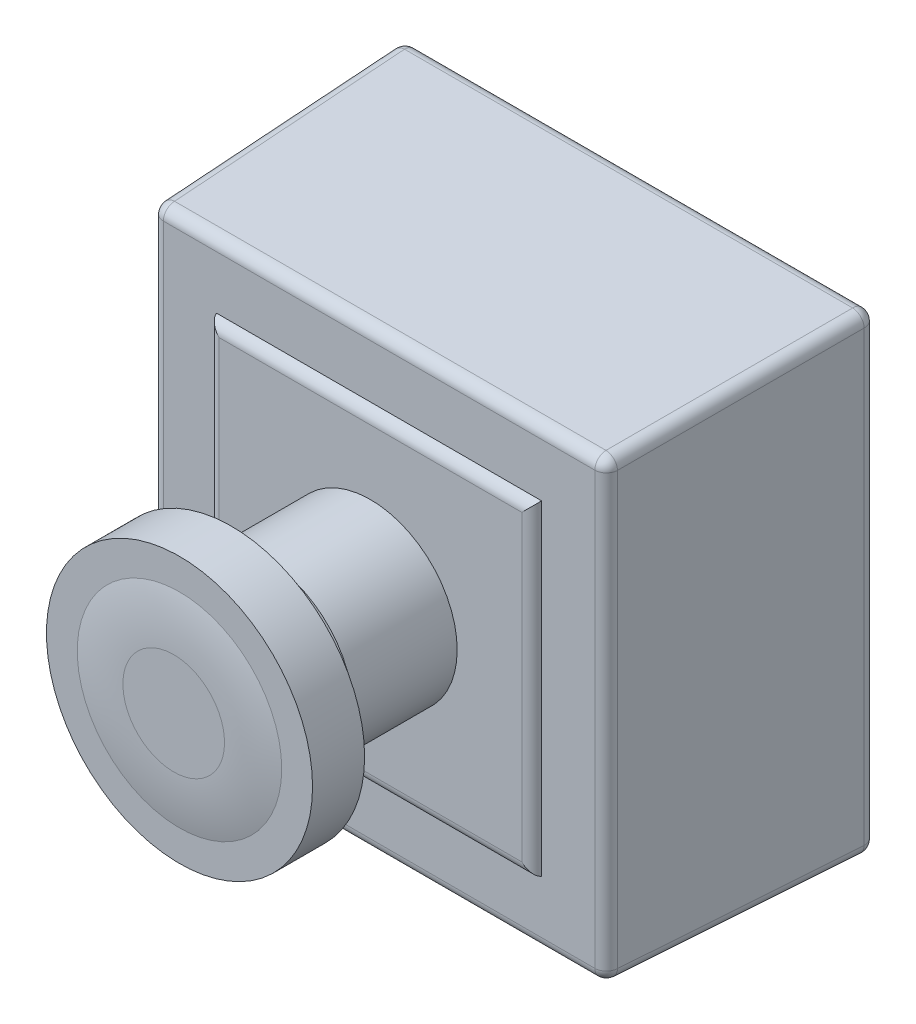
ISO-10303-21;
HEADER;
FILE_DESCRIPTION(('STEP AP214'),'2;1');
FILE_NAME('part.step','',(''),(''),'','','');
FILE_SCHEMA(('AUTOMOTIVE_DESIGN { 1 0 10303 214 1 1 1 1 }'));
ENDSEC;
DATA;
#1=APPLICATION_CONTEXT('core data for automotive mechanical design processes');
#2=APPLICATION_PROTOCOL_DEFINITION('international standard','automotive_design',2000,#1);
#3=PRODUCT_CONTEXT('',#1,'mechanical');
#4=PRODUCT('Part','Part','',(#3));
#5=PRODUCT_RELATED_PRODUCT_CATEGORY('part','',(#4));
#6=PRODUCT_DEFINITION_FORMATION('','',#4);
#7=PRODUCT_DEFINITION_CONTEXT('part definition',#1,'design');
#8=PRODUCT_DEFINITION('design','',#6,#7);
#9=PRODUCT_DEFINITION_SHAPE('','',#8);
#10=(LENGTH_UNIT() NAMED_UNIT(*) SI_UNIT(.MILLI.,.METRE.));
#11=(NAMED_UNIT(*) PLANE_ANGLE_UNIT() SI_UNIT($,.RADIAN.));
#12=(NAMED_UNIT(*) SI_UNIT($,.STERADIAN.) SOLID_ANGLE_UNIT());
#13=UNCERTAINTY_MEASURE_WITH_UNIT(LENGTH_MEASURE(1.E-05),#10,'distance_accuracy_value','');
#14=(GEOMETRIC_REPRESENTATION_CONTEXT(3) GLOBAL_UNCERTAINTY_ASSIGNED_CONTEXT((#13)) GLOBAL_UNIT_ASSIGNED_CONTEXT((#10,
#11,#12)) REPRESENTATION_CONTEXT('',''));
#15=CARTESIAN_POINT('',(0.,0.,0.));
#16=DIRECTION('',(0.,0.,1.));
#17=DIRECTION('',(1.,0.,0.));
#18=AXIS2_PLACEMENT_3D('',#15,#16,#17);
#19=CARTESIAN_POINT('',(0.,0.,22.6));
#20=DIRECTION('',(0.,0.,1.));
#21=DIRECTION('',(1.,0.,0.));
#22=AXIS2_PLACEMENT_3D('',#19,#20,#21);
#23=PLANE('',#22);
#24=DIRECTION('',(0.,1.,0.));
#25=VECTOR('',#24,1.);
#26=CARTESIAN_POINT('',(-18.6451018346794,-19.6107906094865,22.6));
#27=LINE('',#26,#25);
#28=CARTESIAN_POINT('',(-18.6451018346794,18.6451018346794,22.6));
#29=VERTEX_POINT('',#28);
#30=CARTESIAN_POINT('',(-18.6451018346794,-18.6451018346794,22.6));
#31=VERTEX_POINT('',#30);
#32=EDGE_CURVE('E211',#29,#31,#27,.F.);
#33=ORIENTED_EDGE('',*,*,#32,.T.);
#34=DIRECTION('',(-1.,0.,0.));
#35=VECTOR('',#34,1.);
#36=CARTESIAN_POINT('',(19.6107906094865,-18.6451018346794,22.6));
#37=LINE('',#36,#35);
#38=CARTESIAN_POINT('',(18.6451018346794,-18.6451018346794,22.6));
#39=VERTEX_POINT('',#38);
#40=EDGE_CURVE('E213',#31,#39,#37,.F.);
#41=ORIENTED_EDGE('',*,*,#40,.T.);
#42=DIRECTION('',(0.,-1.,0.));
#43=VECTOR('',#42,1.);
#44=CARTESIAN_POINT('',(18.6451018346794,19.6107906094865,22.6));
#45=LINE('',#44,#43);
#46=CARTESIAN_POINT('',(18.6451018346794,18.6451018346794,22.6));
#47=VERTEX_POINT('',#46);
#48=EDGE_CURVE('E207',#39,#47,#45,.F.);
#49=ORIENTED_EDGE('',*,*,#48,.T.);
#50=DIRECTION('',(1.,0.,0.));
#51=VECTOR('',#50,1.);
#52=CARTESIAN_POINT('',(-19.6107906094865,18.6451018346794,22.6));
#53=LINE('',#52,#51);
#54=EDGE_CURVE('E209',#47,#29,#53,.F.);
#55=ORIENTED_EDGE('',*,*,#54,.T.);
#56=EDGE_LOOP('',(#33,#41,#49,#55));
#57=FACE_BOUND('',#56,.T.);
#58=DIRECTION('',(1.,0.,0.));
#59=VECTOR('',#58,1.);
#60=CARTESIAN_POINT('',(0.,14.05,22.6));
#61=LINE('',#60,#59);
#62=CARTESIAN_POINT('',(-14.05,14.05,22.6));
#63=VERTEX_POINT('',#62);
#64=CARTESIAN_POINT('',(14.05,14.05,22.6));
#65=VERTEX_POINT('',#64);
#66=EDGE_CURVE('E186',#63,#65,#61,.T.);
#67=ORIENTED_EDGE('',*,*,#66,.T.);
#68=DIRECTION('',(0.,-1.,0.));
#69=VECTOR('',#68,1.);
#70=CARTESIAN_POINT('',(14.05,0.,22.6));
#71=LINE('',#70,#69);
#72=CARTESIAN_POINT('',(14.05,-14.05,22.6));
#73=VERTEX_POINT('',#72);
#74=EDGE_CURVE('E167',#65,#73,#71,.T.);
#75=ORIENTED_EDGE('',*,*,#74,.T.);
#76=DIRECTION('',(-1.,0.,0.));
#77=VECTOR('',#76,1.);
#78=CARTESIAN_POINT('',(0.,-14.05,22.6));
#79=LINE('',#78,#77);
#80=CARTESIAN_POINT('',(-14.05,-14.05,22.6));
#81=VERTEX_POINT('',#80);
#82=EDGE_CURVE('E177',#73,#81,#79,.T.);
#83=ORIENTED_EDGE('',*,*,#82,.T.);
#84=DIRECTION('',(0.,1.,0.));
#85=VECTOR('',#84,1.);
#86=CARTESIAN_POINT('',(-14.05,0.,22.6));
#87=LINE('',#86,#85);
#88=EDGE_CURVE('E183',#81,#63,#87,.T.);
#89=ORIENTED_EDGE('',*,*,#88,.T.);
#90=EDGE_LOOP('',(#67,#75,#83,#89));
#91=FACE_BOUND('',#90,.T.);
#92=ADVANCED_FACE('F46',(#57,#91),#23,.T.);
#93=CARTESIAN_POINT('',(20.4,20.4,0.));
#94=DIRECTION('',(0.999390827019096,0.,0.034899496702501));
#95=DIRECTION('',(0.034899496702501,0.,-0.999390827019096));
#96=AXIS2_PLACEMENT_3D('',#93,#94,#95);
#97=PLANE('',#96);
#98=DIRECTION('',(0.,1.,0.));
#99=VECTOR('',#98,1.);
#100=CARTESIAN_POINT('',(19.6444926616985,-19.6107906094865,21.6348994967025));
#101=LINE('',#100,#99);
#102=CARTESIAN_POINT('',(19.6444926616985,18.6451018346794,21.6348994967025));
#103=VERTEX_POINT('',#102);
#104=CARTESIAN_POINT('',(19.6444926616985,-18.6451018346794,21.6348994967025));
#105=VERTEX_POINT('',#104);
#106=EDGE_CURVE('E247',#103,#105,#101,.F.);
#107=ORIENTED_EDGE('',*,*,#106,.T.);
#108=DIRECTION('',(-0.0348782627423747,0.0348782627423747,0.998782765958718));
#109=VECTOR('',#108,1.);
#110=CARTESIAN_POINT('',(20.3515828291105,-19.3521920020914,1.38648636883266));
#111=LINE('',#110,#109);
#112=CARTESIAN_POINT('',(20.3638605132285,-19.3644696862094,1.0348994967025));
#113=VERTEX_POINT('',#112);
#114=EDGE_CURVE('E250',#105,#113,#111,.F.);
#115=ORIENTED_EDGE('',*,*,#114,.T.);
#116=DIRECTION('',(0.,1.,0.));
#117=VECTOR('',#116,1.);
#118=CARTESIAN_POINT('',(20.3638605132285,20.4,1.0348994967025));
#119=LINE('',#118,#117);
#120=CARTESIAN_POINT('',(20.3638605132285,19.3644696862094,1.0348994967025));
#121=VERTEX_POINT('',#120);
#122=EDGE_CURVE('E245',#113,#121,#119,.T.);
#123=ORIENTED_EDGE('',*,*,#122,.T.);
#124=DIRECTION('',(-0.0348782627423747,-0.0348782627423747,0.998782765958718));
#125=VECTOR('',#124,1.);
#126=CARTESIAN_POINT('',(20.4012157521571,19.401824925138,-0.0348145867008246));
#127=LINE('',#126,#125);
#128=EDGE_CURVE('E243',#121,#103,#127,.T.);
#129=ORIENTED_EDGE('',*,*,#128,.T.);
#130=EDGE_LOOP('',(#107,#115,#123,#129));
#131=FACE_BOUND('',#130,.T.);
#132=ADVANCED_FACE('F367',(#131),#97,.T.);
#133=CARTESIAN_POINT('',(-20.4,20.4,0.));
#134=DIRECTION('',(0.,0.999390827019096,0.034899496702501));
#135=DIRECTION('',(0.,-0.034899496702501,0.999390827019096));
#136=AXIS2_PLACEMENT_3D('',#133,#134,#135);
#137=PLANE('',#136);
#138=DIRECTION('',(-1.,0.,0.));
#139=VECTOR('',#138,1.);
#140=CARTESIAN_POINT('',(19.6107906094865,19.6444926616985,21.6348994967025));
#141=LINE('',#140,#139);
#142=CARTESIAN_POINT('',(-18.6451018346794,19.6444926616985,21.6348994967025));
#143=VERTEX_POINT('',#142);
#144=CARTESIAN_POINT('',(18.6451018346794,19.6444926616985,21.6348994967025));
#145=VERTEX_POINT('',#144);
#146=EDGE_CURVE('E238',#143,#145,#141,.F.);
#147=ORIENTED_EDGE('',*,*,#146,.T.);
#148=DIRECTION('',(-0.0348782627423747,-0.0348782627423747,0.998782765958718));
#149=VECTOR('',#148,1.);
#150=CARTESIAN_POINT('',(19.3521920020914,20.3515828291105,1.38648636883266));
#151=LINE('',#150,#149);
#152=CARTESIAN_POINT('',(19.3644696862094,20.3638605132285,1.0348994967025));
#153=VERTEX_POINT('',#152);
#154=EDGE_CURVE('E241',#145,#153,#151,.F.);
#155=ORIENTED_EDGE('',*,*,#154,.T.);
#156=DIRECTION('',(-1.,0.,0.));
#157=VECTOR('',#156,1.);
#158=CARTESIAN_POINT('',(-20.4,20.3638605132285,1.0348994967025));
#159=LINE('',#158,#157);
#160=CARTESIAN_POINT('',(-19.3644696862094,20.3638605132285,1.0348994967025));
#161=VERTEX_POINT('',#160);
#162=EDGE_CURVE('E236',#153,#161,#159,.T.);
#163=ORIENTED_EDGE('',*,*,#162,.T.);
#164=DIRECTION('',(0.0348782627423747,-0.0348782627423747,0.998782765958718));
#165=VECTOR('',#164,1.);
#166=CARTESIAN_POINT('',(-19.401824925138,20.4012157521571,-0.0348145867008245));
#167=LINE('',#166,#165);
#168=EDGE_CURVE('E234',#161,#143,#167,.T.);
#169=ORIENTED_EDGE('',*,*,#168,.T.);
#170=EDGE_LOOP('',(#147,#155,#163,#169));
#171=FACE_BOUND('',#170,.T.);
#172=ADVANCED_FACE('F372',(#171),#137,.T.);
#173=CARTESIAN_POINT('',(-20.4,20.4,0.));
#174=DIRECTION('',(-0.999390827019096,0.,0.034899496702501));
#175=DIRECTION('',(0.034899496702501,0.,0.999390827019096));
#176=AXIS2_PLACEMENT_3D('',#173,#174,#175);
#177=PLANE('',#176);
#178=DIRECTION('',(0.,-1.,0.));
#179=VECTOR('',#178,1.);
#180=CARTESIAN_POINT('',(-20.3638605132285,20.4,1.0348994967025));
#181=LINE('',#180,#179);
#182=CARTESIAN_POINT('',(-20.3638605132285,19.3644696862094,1.0348994967025));
#183=VERTEX_POINT('',#182);
#184=CARTESIAN_POINT('',(-20.3638605132285,-19.3644696862094,1.0348994967025));
#185=VERTEX_POINT('',#184);
#186=EDGE_CURVE('E227',#183,#185,#181,.T.);
#187=ORIENTED_EDGE('',*,*,#186,.T.);
#188=DIRECTION('',(0.0348782627423747,0.0348782627423747,0.998782765958718));
#189=VECTOR('',#188,1.);
#190=CARTESIAN_POINT('',(-20.3515828291105,-19.3521920020914,1.38648636883266));
#191=LINE('',#190,#189);
#192=CARTESIAN_POINT('',(-19.6444926616985,-18.6451018346794,21.6348994967025));
#193=VERTEX_POINT('',#192);
#194=EDGE_CURVE('E232',#185,#193,#191,.T.);
#195=ORIENTED_EDGE('',*,*,#194,.T.);
#196=DIRECTION('',(0.,-1.,0.));
#197=VECTOR('',#196,1.);
#198=CARTESIAN_POINT('',(-19.6444926616985,19.6107906094865,21.6348994967025));
#199=LINE('',#198,#197);
#200=CARTESIAN_POINT('',(-19.6444926616985,18.6451018346794,21.6348994967025));
#201=VERTEX_POINT('',#200);
#202=EDGE_CURVE('E229',#193,#201,#199,.F.);
#203=ORIENTED_EDGE('',*,*,#202,.T.);
#204=DIRECTION('',(0.0348782627423747,-0.0348782627423747,0.998782765958718));
#205=VECTOR('',#204,1.);
#206=CARTESIAN_POINT('',(-20.4012157521571,19.401824925138,-0.0348145867008245));
#207=LINE('',#206,#205);
#208=EDGE_CURVE('E225',#201,#183,#207,.F.);
#209=ORIENTED_EDGE('',*,*,#208,.T.);
#210=EDGE_LOOP('',(#187,#195,#203,#209));
#211=FACE_BOUND('',#210,.T.);
#212=ADVANCED_FACE('F378',(#211),#177,.T.);
#213=CARTESIAN_POINT('',(-20.4,-20.4,0.));
#214=DIRECTION('',(0.,-0.999390827019096,0.034899496702501));
#215=DIRECTION('',(0.,-0.034899496702501,-0.999390827019096));
#216=AXIS2_PLACEMENT_3D('',#213,#214,#215);
#217=PLANE('',#216);
#218=DIRECTION('',(1.,0.,0.));
#219=VECTOR('',#218,1.);
#220=CARTESIAN_POINT('',(-19.6107906094865,-19.6444926616985,21.6348994967025));
#221=LINE('',#220,#219);
#222=CARTESIAN_POINT('',(18.6451018346794,-19.6444926616985,21.6348994967025));
#223=VERTEX_POINT('',#222);
#224=CARTESIAN_POINT('',(-18.6451018346794,-19.6444926616985,21.6348994967025));
#225=VERTEX_POINT('',#224);
#226=EDGE_CURVE('E220',#223,#225,#221,.F.);
#227=ORIENTED_EDGE('',*,*,#226,.T.);
#228=DIRECTION('',(0.0348782627423747,0.0348782627423747,0.998782765958718));
#229=VECTOR('',#228,1.);
#230=CARTESIAN_POINT('',(-19.401824925138,-20.4012157521571,-0.0348145867008245));
#231=LINE('',#230,#229);
#232=CARTESIAN_POINT('',(-19.3644696862094,-20.3638605132285,1.0348994967025));
#233=VERTEX_POINT('',#232);
#234=EDGE_CURVE('E223',#225,#233,#231,.F.);
#235=ORIENTED_EDGE('',*,*,#234,.T.);
#236=DIRECTION('',(1.,0.,0.));
#237=VECTOR('',#236,1.);
#238=CARTESIAN_POINT('',(-20.4,-20.3638605132285,1.0348994967025));
#239=LINE('',#238,#237);
#240=CARTESIAN_POINT('',(19.3644696862094,-20.3638605132285,1.0348994967025));
#241=VERTEX_POINT('',#240);
#242=EDGE_CURVE('E218',#233,#241,#239,.T.);
#243=ORIENTED_EDGE('',*,*,#242,.T.);
#244=DIRECTION('',(-0.0348782627423747,0.0348782627423747,0.998782765958718));
#245=VECTOR('',#244,1.);
#246=CARTESIAN_POINT('',(19.3521920020914,-20.3515828291105,1.38648636883266));
#247=LINE('',#246,#245);
#248=EDGE_CURVE('E216',#241,#223,#247,.T.);
#249=ORIENTED_EDGE('',*,*,#248,.T.);
#250=EDGE_LOOP('',(#227,#235,#243,#249));
#251=FACE_BOUND('',#250,.T.);
#252=ADVANCED_FACE('F361',(#251),#217,.T.);
#253=CARTESIAN_POINT('',(0.,0.,0.));
#254=DIRECTION('',(0.,0.,1.));
#255=DIRECTION('',(1.,0.,0.));
#256=AXIS2_PLACEMENT_3D('',#253,#254,#255);
#257=PLANE('',#256);
#258=DIRECTION('',(-1.,0.,0.));
#259=VECTOR('',#258,1.);
#260=CARTESIAN_POINT('',(0.,-19.3644696862094,0.));
#261=LINE('',#260,#259);
#262=CARTESIAN_POINT('',(19.3644696862094,-19.3644696862094,0.));
#263=VERTEX_POINT('',#262);
#264=CARTESIAN_POINT('',(-19.3644696862094,-19.3644696862094,0.));
#265=VERTEX_POINT('',#264);
#266=EDGE_CURVE('E252',#263,#265,#261,.T.);
#267=ORIENTED_EDGE('',*,*,#266,.T.);
#268=DIRECTION('',(0.,1.,0.));
#269=VECTOR('',#268,1.);
#270=CARTESIAN_POINT('',(-19.3644696862094,0.,0.));
#271=LINE('',#270,#269);
#272=CARTESIAN_POINT('',(-19.3644696862094,19.3644696862094,0.));
#273=VERTEX_POINT('',#272);
#274=EDGE_CURVE('E257',#265,#273,#271,.T.);
#275=ORIENTED_EDGE('',*,*,#274,.T.);
#276=DIRECTION('',(1.,0.,0.));
#277=VECTOR('',#276,1.);
#278=CARTESIAN_POINT('',(0.,19.3644696862094,0.));
#279=LINE('',#278,#277);
#280=CARTESIAN_POINT('',(19.3644696862094,19.3644696862094,0.));
#281=VERTEX_POINT('',#280);
#282=EDGE_CURVE('E69',#273,#281,#279,.T.);
#283=ORIENTED_EDGE('',*,*,#282,.T.);
#284=DIRECTION('',(0.,-1.,0.));
#285=VECTOR('',#284,1.);
#286=CARTESIAN_POINT('',(19.3644696862094,0.,0.));
#287=LINE('',#286,#285);
#288=EDGE_CURVE('E254',#281,#263,#287,.T.);
#289=ORIENTED_EDGE('',*,*,#288,.T.);
#290=EDGE_LOOP('',(#267,#275,#283,#289));
#291=FACE_BOUND('',#290,.T.);
#292=CARTESIAN_POINT('',(9.4,11.9,0.));
#293=DIRECTION('',(0.,0.,1.));
#294=DIRECTION('',(1.,0.,0.));
#295=AXIS2_PLACEMENT_3D('',#292,#293,#294);
#296=CIRCLE('',#295,2.5);
#297=CARTESIAN_POINT('',(11.9,11.9,0.));
#298=VERTEX_POINT('',#297);
#299=EDGE_CURVE('E204',#298,#298,#296,.F.);
#300=ORIENTED_EDGE('',*,*,#299,.F.);
#301=EDGE_LOOP('',(#300));
#302=FACE_BOUND('',#301,.T.);
#303=ADVANCED_FACE('F353',(#291,#302),#257,.F.);
#304=CARTESIAN_POINT('',(0.,0.,23.35));
#305=DIRECTION('',(0.,0.,1.));
#306=DIRECTION('',(1.,0.,0.));
#307=AXIS2_PLACEMENT_3D('',#304,#305,#306);
#308=PLANE('',#307);
#309=CARTESIAN_POINT('',(0.,0.,23.35));
#310=DIRECTION('',(0.,0.,1.));
#311=DIRECTION('',(1.,0.,0.));
#312=AXIS2_PLACEMENT_3D('',#309,#310,#311);
#313=CIRCLE('',#312,7.5);
#314=CARTESIAN_POINT('',(7.5,0.,23.35));
#315=VERTEX_POINT('',#314);
#316=EDGE_CURVE('E332',#315,#315,#313,.T.);
#317=ORIENTED_EDGE('',*,*,#316,.F.);
#318=EDGE_LOOP('',(#317));
#319=FACE_BOUND('',#318,.T.);
#320=DIRECTION('',(-1.,0.,0.));
#321=VECTOR('',#320,1.);
#322=CARTESIAN_POINT('',(14.05,-13.0817541634481,23.35));
#323=LINE('',#322,#321);
#324=CARTESIAN_POINT('',(-13.0817541634481,-13.0817541634481,23.35));
#325=VERTEX_POINT('',#324);
#326=CARTESIAN_POINT('',(13.0817541634481,-13.0817541634481,23.35));
#327=VERTEX_POINT('',#326);
#328=EDGE_CURVE('E189',#325,#327,#323,.F.);
#329=ORIENTED_EDGE('',*,*,#328,.T.);
#330=DIRECTION('',(0.,-1.,0.));
#331=VECTOR('',#330,1.);
#332=CARTESIAN_POINT('',(13.0817541634481,14.05,23.35));
#333=LINE('',#332,#331);
#334=CARTESIAN_POINT('',(13.0817541634481,13.0817541634481,23.35));
#335=VERTEX_POINT('',#334);
#336=EDGE_CURVE('E170',#327,#335,#333,.F.);
#337=ORIENTED_EDGE('',*,*,#336,.T.);
#338=DIRECTION('',(1.,0.,0.));
#339=VECTOR('',#338,1.);
#340=CARTESIAN_POINT('',(-14.05,13.0817541634481,23.35));
#341=LINE('',#340,#339);
#342=CARTESIAN_POINT('',(-13.0817541634481,13.0817541634481,23.35));
#343=VERTEX_POINT('',#342);
#344=EDGE_CURVE('E195',#335,#343,#341,.F.);
#345=ORIENTED_EDGE('',*,*,#344,.T.);
#346=DIRECTION('',(0.,1.,0.));
#347=VECTOR('',#346,1.);
#348=CARTESIAN_POINT('',(-13.0817541634481,-14.05,23.35));
#349=LINE('',#348,#347);
#350=EDGE_CURVE('E187',#343,#325,#349,.F.);
#351=ORIENTED_EDGE('',*,*,#350,.T.);
#352=EDGE_LOOP('',(#329,#337,#345,#351));
#353=FACE_BOUND('',#352,.T.);
#354=ADVANCED_FACE('F351',(#319,#353),#308,.T.);
#355=CARTESIAN_POINT('',(-13.0817541634481,14.05,22.35));
#356=DIRECTION('',(0.,-1.,0.));
#357=DIRECTION('',(1.,0.,0.));
#358=AXIS2_PLACEMENT_3D('',#355,#356,#357);
#359=CYLINDRICAL_SURFACE('',#358,1.);
#360=CARTESIAN_POINT('',(-13.0817541634481,13.0817541634481,22.35));
#361=DIRECTION('',(-0.707106781186547,-0.707106781186548,0.));
#362=DIRECTION('',(0.707106781186548,-0.707106781186547,0.));
#363=AXIS2_PLACEMENT_3D('',#360,#361,#362);
#364=ELLIPSE('',#363,1.4142135623731,1.);
#365=EDGE_CURVE('E173',#63,#343,#364,.F.);
#366=ORIENTED_EDGE('',*,*,#365,.F.);
#367=ORIENTED_EDGE('',*,*,#88,.F.);
#368=CARTESIAN_POINT('',(-13.0817541634481,-13.0817541634481,22.35));
#369=DIRECTION('',(0.707106781186548,-0.707106781186547,0.));
#370=DIRECTION('',(-0.707106781186547,-0.707106781186548,0.));
#371=AXIS2_PLACEMENT_3D('',#368,#369,#370);
#372=ELLIPSE('',#371,1.41421356237309,1.);
#373=EDGE_CURVE('E180',#325,#81,#372,.T.);
#374=ORIENTED_EDGE('',*,*,#373,.F.);
#375=ORIENTED_EDGE('',*,*,#350,.F.);
#376=EDGE_LOOP('',(#366,#367,#374,#375));
#377=FACE_BOUND('',#376,.T.);
#378=ADVANCED_FACE('F346',(#377),#359,.T.);
#379=CARTESIAN_POINT('',(-14.05,-13.0817541634481,22.35));
#380=DIRECTION('',(1.,0.,0.));
#381=DIRECTION('',(0.,0.,-1.));
#382=AXIS2_PLACEMENT_3D('',#379,#380,#381);
#383=CYLINDRICAL_SURFACE('',#382,1.);
#384=ORIENTED_EDGE('',*,*,#373,.T.);
#385=ORIENTED_EDGE('',*,*,#82,.F.);
#386=CARTESIAN_POINT('',(13.0817541634481,-13.0817541634481,22.35));
#387=DIRECTION('',(0.707106781186547,0.707106781186548,0.));
#388=DIRECTION('',(0.707106781186548,-0.707106781186547,0.));
#389=AXIS2_PLACEMENT_3D('',#386,#387,#388);
#390=ELLIPSE('',#389,1.4142135623731,1.);
#391=EDGE_CURVE('E163',#327,#73,#390,.T.);
#392=ORIENTED_EDGE('',*,*,#391,.F.);
#393=ORIENTED_EDGE('',*,*,#328,.F.);
#394=EDGE_LOOP('',(#384,#385,#392,#393));
#395=FACE_BOUND('',#394,.T.);
#396=ADVANCED_FACE('F178',(#395),#383,.T.);
#397=CARTESIAN_POINT('',(-14.05,13.0817541634481,22.35));
#398=DIRECTION('',(-1.,0.,0.));
#399=DIRECTION('',(0.,0.,1.));
#400=AXIS2_PLACEMENT_3D('',#397,#398,#399);
#401=CYLINDRICAL_SURFACE('',#400,1.);
#402=ORIENTED_EDGE('',*,*,#365,.T.);
#403=ORIENTED_EDGE('',*,*,#344,.F.);
#404=CARTESIAN_POINT('',(13.0817541634481,13.0817541634481,22.35));
#405=DIRECTION('',(-0.707106781186548,0.707106781186547,0.));
#406=DIRECTION('',(-0.707106781186547,-0.707106781186548,0.));
#407=AXIS2_PLACEMENT_3D('',#404,#405,#406);
#408=ELLIPSE('',#407,1.41421356237309,1.);
#409=EDGE_CURVE('E174',#65,#335,#408,.F.);
#410=ORIENTED_EDGE('',*,*,#409,.F.);
#411=ORIENTED_EDGE('',*,*,#66,.F.);
#412=EDGE_LOOP('',(#402,#403,#410,#411));
#413=FACE_BOUND('',#412,.T.);
#414=ADVANCED_FACE('F349',(#413),#401,.T.);
#415=CARTESIAN_POINT('',(13.0817541634481,14.05,22.35));
#416=DIRECTION('',(0.,1.,0.));
#417=DIRECTION('',(-1.,0.,0.));
#418=AXIS2_PLACEMENT_3D('',#415,#416,#417);
#419=CYLINDRICAL_SURFACE('',#418,1.);
#420=ORIENTED_EDGE('',*,*,#391,.T.);
#421=ORIENTED_EDGE('',*,*,#74,.F.);
#422=ORIENTED_EDGE('',*,*,#409,.T.);
#423=ORIENTED_EDGE('',*,*,#336,.F.);
#424=EDGE_LOOP('',(#420,#421,#422,#423));
#425=FACE_BOUND('',#424,.T.);
#426=ADVANCED_FACE('F165',(#425),#419,.T.);
#427=CARTESIAN_POINT('',(0.,0.,32.35));
#428=DIRECTION('',(0.,0.,-1.));
#429=DIRECTION('',(-1.,0.,0.));
#430=AXIS2_PLACEMENT_3D('',#427,#428,#429);
#431=CYLINDRICAL_SURFACE('',#430,7.5);
#432=CARTESIAN_POINT('',(0.,0.,32.35));
#433=DIRECTION('',(0.,0.,1.));
#434=DIRECTION('',(1.,0.,0.));
#435=AXIS2_PLACEMENT_3D('',#432,#433,#434);
#436=CIRCLE('',#435,7.5);
#437=CARTESIAN_POINT('',(7.5,0.,32.35));
#438=VERTEX_POINT('',#437);
#439=EDGE_CURVE('E199',#438,#438,#436,.T.);
#440=ORIENTED_EDGE('',*,*,#439,.F.);
#441=EDGE_LOOP('',(#440));
#442=FACE_BOUND('',#441,.T.);
#443=ORIENTED_EDGE('',*,*,#316,.T.);
#444=EDGE_LOOP('',(#443));
#445=FACE_BOUND('',#444,.T.);
#446=ADVANCED_FACE('F388',(#442,#445),#431,.T.);
#447=CARTESIAN_POINT('',(0.,0.,32.35));
#448=DIRECTION('',(0.,0.,1.));
#449=DIRECTION('',(1.,0.,0.));
#450=AXIS2_PLACEMENT_3D('',#447,#448,#449);
#451=PLANE('',#450);
#452=CARTESIAN_POINT('',(0.,0.,32.35));
#453=DIRECTION('',(0.,0.,1.));
#454=DIRECTION('',(1.,0.,0.));
#455=AXIS2_PLACEMENT_3D('',#452,#453,#454);
#456=CIRCLE('',#455,5.8);
#457=CARTESIAN_POINT('',(5.8,0.,32.35));
#458=VERTEX_POINT('',#457);
#459=EDGE_CURVE('E198',#458,#458,#456,.T.);
#460=ORIENTED_EDGE('',*,*,#459,.F.);
#461=EDGE_LOOP('',(#460));
#462=FACE_BOUND('',#461,.T.);
#463=ORIENTED_EDGE('',*,*,#439,.T.);
#464=EDGE_LOOP('',(#463));
#465=FACE_BOUND('',#464,.T.);
#466=ADVANCED_FACE('F527',(#462,#465),#451,.T.);
#467=CARTESIAN_POINT('',(0.,0.,35.35));
#468=DIRECTION('',(0.,0.,-1.));
#469=DIRECTION('',(-1.,0.,0.));
#470=AXIS2_PLACEMENT_3D('',#467,#468,#469);
#471=CYLINDRICAL_SURFACE('',#470,5.8);
#472=CARTESIAN_POINT('',(0.,0.,35.35));
#473=DIRECTION('',(0.,0.,1.));
#474=DIRECTION('',(1.,0.,0.));
#475=AXIS2_PLACEMENT_3D('',#472,#473,#474);
#476=CIRCLE('',#475,5.8);
#477=CARTESIAN_POINT('',(5.8,0.,35.35));
#478=VERTEX_POINT('',#477);
#479=EDGE_CURVE('E327',#478,#478,#476,.T.);
#480=ORIENTED_EDGE('',*,*,#479,.F.);
#481=EDGE_LOOP('',(#480));
#482=FACE_BOUND('',#481,.T.);
#483=ORIENTED_EDGE('',*,*,#459,.T.);
#484=EDGE_LOOP('',(#483));
#485=FACE_BOUND('',#484,.T.);
#486=ADVANCED_FACE('F521',(#482,#485),#471,.T.);
#487=CARTESIAN_POINT('',(9.4,11.9,-5.));
#488=DIRECTION('',(0.,0.,1.));
#489=DIRECTION('',(1.,0.,0.));
#490=AXIS2_PLACEMENT_3D('',#487,#488,#489);
#491=CYLINDRICAL_SURFACE('',#490,2.5);
#492=CARTESIAN_POINT('',(9.4,11.9,-5.));
#493=DIRECTION('',(0.,0.,-1.));
#494=DIRECTION('',(-1.,0.,0.));
#495=AXIS2_PLACEMENT_3D('',#492,#493,#494);
#496=CIRCLE('',#495,2.5);
#497=CARTESIAN_POINT('',(6.9,11.9,-5.));
#498=VERTEX_POINT('',#497);
#499=EDGE_CURVE('E322',#498,#498,#496,.T.);
#500=ORIENTED_EDGE('',*,*,#499,.F.);
#501=EDGE_LOOP('',(#500));
#502=FACE_BOUND('',#501,.T.);
#503=ORIENTED_EDGE('',*,*,#299,.T.);
#504=EDGE_LOOP('',(#503));
#505=FACE_BOUND('',#504,.T.);
#506=ADVANCED_FACE('F474',(#502,#505),#491,.T.);
#507=CARTESIAN_POINT('',(9.4,11.9,-5.));
#508=DIRECTION('',(0.,0.,-1.));
#509=DIRECTION('',(-1.,0.,0.));
#510=AXIS2_PLACEMENT_3D('',#507,#508,#509);
#511=PLANE('',#510);
#512=ORIENTED_EDGE('',*,*,#499,.T.);
#513=EDGE_LOOP('',(#512));
#514=FACE_BOUND('',#513,.T.);
#515=ADVANCED_FACE('F469',(#514),#511,.T.);
#516=CARTESIAN_POINT('',(-20.4,19.3644696862094,1.));
#517=DIRECTION('',(1.,0.,0.));
#518=DIRECTION('',(0.,0.,-1.));
#519=AXIS2_PLACEMENT_3D('',#516,#517,#518);
#520=CYLINDRICAL_SURFACE('',#519,1.);
#521=CARTESIAN_POINT('',(-19.3644696862094,19.3644696862094,1.));
#522=DIRECTION('',(-1.,0.,0.));
#523=DIRECTION('',(0.,0.,1.));
#524=AXIS2_PLACEMENT_3D('',#521,#522,#523);
#525=CIRCLE('',#524,1.);
#526=EDGE_CURVE('E321',#161,#273,#525,.T.);
#527=ORIENTED_EDGE('',*,*,#526,.F.);
#528=ORIENTED_EDGE('',*,*,#162,.F.);
#529=CARTESIAN_POINT('',(19.3644696862094,19.3644696862094,1.));
#530=DIRECTION('',(1.,0.,0.));
#531=DIRECTION('',(0.,1.,0.));
#532=AXIS2_PLACEMENT_3D('',#529,#530,#531);
#533=CIRCLE('',#532,1.);
#534=EDGE_CURVE('E319',#281,#153,#533,.T.);
#535=ORIENTED_EDGE('',*,*,#534,.F.);
#536=ORIENTED_EDGE('',*,*,#282,.F.);
#537=EDGE_LOOP('',(#527,#528,#535,#536));
#538=FACE_BOUND('',#537,.T.);
#539=ADVANCED_FACE('F467',(#538),#520,.T.);
#540=CARTESIAN_POINT('',(-19.3644696862094,19.3644696862094,1.));
#541=DIRECTION('',(0.,0.,-1.));
#542=DIRECTION('',(-1.,0.,0.));
#543=AXIS2_PLACEMENT_3D('',#540,#541,#542);
#544=SPHERICAL_SURFACE('',#543,1.);
#545=CARTESIAN_POINT('',(-19.3644696862094,19.3644696862094,1.));
#546=DIRECTION('',(-0.0348782627423748,0.0348782627423746,-0.998782765958718));
#547=DIRECTION('',(-0.999390827019096,0.,0.0348994967025011));
#548=AXIS2_PLACEMENT_3D('',#545,#546,#547);
#549=CIRCLE('',#548,1.);
#550=EDGE_CURVE('E315',#161,#183,#549,.F.);
#551=ORIENTED_EDGE('',*,*,#550,.F.);
#552=ORIENTED_EDGE('',*,*,#526,.T.);
#553=CARTESIAN_POINT('',(-19.3644696862094,19.3644696862094,1.));
#554=DIRECTION('',(0.,1.,0.));
#555=DIRECTION('',(0.,0.,1.));
#556=AXIS2_PLACEMENT_3D('',#553,#554,#555);
#557=CIRCLE('',#556,1.);
#558=EDGE_CURVE('E61',#183,#273,#557,.F.);
#559=ORIENTED_EDGE('',*,*,#558,.F.);
#560=EDGE_LOOP('',(#551,#552,#559));
#561=FACE_BOUND('',#560,.T.);
#562=ADVANCED_FACE('F464',(#561),#544,.T.);
#563=CARTESIAN_POINT('',(19.3644696862094,19.3644696862094,1.));
#564=DIRECTION('',(0.,0.,-1.));
#565=DIRECTION('',(-1.,0.,0.));
#566=AXIS2_PLACEMENT_3D('',#563,#564,#565);
#567=SPHERICAL_SURFACE('',#566,1.);
#568=CARTESIAN_POINT('',(19.3644696862094,19.3644696862094,1.));
#569=DIRECTION('',(0.,1.,0.));
#570=DIRECTION('',(0.,0.,1.));
#571=AXIS2_PLACEMENT_3D('',#568,#569,#570);
#572=CIRCLE('',#571,1.);
#573=EDGE_CURVE('E309',#281,#121,#572,.F.);
#574=ORIENTED_EDGE('',*,*,#573,.F.);
#575=ORIENTED_EDGE('',*,*,#534,.T.);
#576=CARTESIAN_POINT('',(19.3644696862094,19.3644696862094,1.));
#577=DIRECTION('',(0.0348782627423746,0.0348782627423748,-0.998782765958718));
#578=DIRECTION('',(0.,0.999390827019096,0.0348994967025011));
#579=AXIS2_PLACEMENT_3D('',#576,#577,#578);
#580=CIRCLE('',#579,1.);
#581=EDGE_CURVE('E312',#121,#153,#580,.F.);
#582=ORIENTED_EDGE('',*,*,#581,.F.);
#583=EDGE_LOOP('',(#574,#575,#582));
#584=FACE_BOUND('',#583,.T.);
#585=ADVANCED_FACE('F461',(#584),#567,.T.);
#586=CARTESIAN_POINT('',(-19.3644696862094,20.4,1.));
#587=DIRECTION('',(0.,1.,0.));
#588=DIRECTION('',(-1.,0.,0.));
#589=AXIS2_PLACEMENT_3D('',#586,#587,#588);
#590=CYLINDRICAL_SURFACE('',#589,1.);
#591=ORIENTED_EDGE('',*,*,#558,.T.);
#592=ORIENTED_EDGE('',*,*,#274,.F.);
#593=CARTESIAN_POINT('',(-19.3644696862094,-19.3644696862094,1.));
#594=DIRECTION('',(0.,-1.,0.));
#595=DIRECTION('',(0.,0.,-1.));
#596=AXIS2_PLACEMENT_3D('',#593,#594,#595);
#597=CIRCLE('',#596,1.);
#598=EDGE_CURVE('E303',#185,#265,#597,.T.);
#599=ORIENTED_EDGE('',*,*,#598,.F.);
#600=ORIENTED_EDGE('',*,*,#186,.F.);
#601=EDGE_LOOP('',(#591,#592,#599,#600));
#602=FACE_BOUND('',#601,.T.);
#603=ADVANCED_FACE('F457',(#602),#590,.T.);
#604=CARTESIAN_POINT('',(-19.401824925138,19.401824925138,-0.0697140834033256));
#605=DIRECTION('',(-0.0348782627423747,0.0348782627423747,-0.998782765958718));
#606=DIRECTION('',(-0.999390827019096,0.,0.034899496702501));
#607=AXIS2_PLACEMENT_3D('',#604,#605,#606);
#608=CYLINDRICAL_SURFACE('',#607,1.);
#609=ORIENTED_EDGE('',*,*,#550,.T.);
#610=ORIENTED_EDGE('',*,*,#208,.F.);
#611=CARTESIAN_POINT('',(-18.6451018346794,18.6451018346794,21.6));
#612=DIRECTION('',(0.0348782627423738,-0.0348782627423737,0.998782765958718));
#613=DIRECTION('',(0.999390827019096,0.,-0.0348994967025002));
#614=AXIS2_PLACEMENT_3D('',#611,#612,#613);
#615=CIRCLE('',#614,1.);
#616=EDGE_CURVE('E300',#143,#201,#615,.T.);
#617=ORIENTED_EDGE('',*,*,#616,.F.);
#618=ORIENTED_EDGE('',*,*,#168,.F.);
#619=EDGE_LOOP('',(#609,#610,#617,#618));
#620=FACE_BOUND('',#619,.T.);
#621=ADVANCED_FACE('F453',(#620),#608,.T.);
#622=CARTESIAN_POINT('',(0.,18.6451018346794,21.6));
#623=DIRECTION('',(-1.,0.,0.));
#624=DIRECTION('',(0.,0.,1.));
#625=AXIS2_PLACEMENT_3D('',#622,#623,#624);
#626=CYLINDRICAL_SURFACE('',#625,1.);
#627=CARTESIAN_POINT('',(18.6451018346794,18.6451018346794,21.6));
#628=DIRECTION('',(1.,0.,0.));
#629=DIRECTION('',(0.,0.,-1.));
#630=AXIS2_PLACEMENT_3D('',#627,#628,#629);
#631=CIRCLE('',#630,1.);
#632=EDGE_CURVE('E294',#145,#47,#631,.T.);
#633=ORIENTED_EDGE('',*,*,#632,.F.);
#634=ORIENTED_EDGE('',*,*,#146,.F.);
#635=CARTESIAN_POINT('',(-18.6451018346794,18.6451018346794,21.6));
#636=DIRECTION('',(-1.,0.,0.));
#637=DIRECTION('',(0.,0.,1.));
#638=AXIS2_PLACEMENT_3D('',#635,#636,#637);
#639=CIRCLE('',#638,1.);
#640=EDGE_CURVE('E297',#29,#143,#639,.T.);
#641=ORIENTED_EDGE('',*,*,#640,.F.);
#642=ORIENTED_EDGE('',*,*,#54,.F.);
#643=EDGE_LOOP('',(#633,#634,#641,#642));
#644=FACE_BOUND('',#643,.T.);
#645=ADVANCED_FACE('F449',(#644),#626,.T.);
#646=CARTESIAN_POINT('',(19.3521920020914,19.3521920020914,1.35158687213016));
#647=DIRECTION('',(0.0348782627423747,0.0348782627423747,-0.998782765958718));
#648=DIRECTION('',(-0.999390827019096,0.,-0.034899496702501));
#649=AXIS2_PLACEMENT_3D('',#646,#647,#648);
#650=CYLINDRICAL_SURFACE('',#649,1.);
#651=ORIENTED_EDGE('',*,*,#581,.T.);
#652=ORIENTED_EDGE('',*,*,#154,.F.);
#653=CARTESIAN_POINT('',(18.6451018346794,18.6451018346794,21.6));
#654=DIRECTION('',(-0.0348782627423737,-0.0348782627423738,0.998782765958718));
#655=DIRECTION('',(0.,-0.999390827019096,-0.0348994967025002));
#656=AXIS2_PLACEMENT_3D('',#653,#654,#655);
#657=CIRCLE('',#656,1.);
#658=EDGE_CURVE('E292',#103,#145,#657,.T.);
#659=ORIENTED_EDGE('',*,*,#658,.F.);
#660=ORIENTED_EDGE('',*,*,#128,.F.);
#661=EDGE_LOOP('',(#651,#652,#659,#660));
#662=FACE_BOUND('',#661,.T.);
#663=ADVANCED_FACE('F445',(#662),#650,.T.);
#664=CARTESIAN_POINT('',(19.3644696862094,20.4,1.));
#665=DIRECTION('',(0.,-1.,0.));
#666=DIRECTION('',(1.,0.,0.));
#667=AXIS2_PLACEMENT_3D('',#664,#665,#666);
#668=CYLINDRICAL_SURFACE('',#667,1.);
#669=ORIENTED_EDGE('',*,*,#573,.T.);
#670=ORIENTED_EDGE('',*,*,#122,.F.);
#671=CARTESIAN_POINT('',(19.3644696862094,-19.3644696862094,1.));
#672=DIRECTION('',(0.,-1.,0.));
#673=DIRECTION('',(1.,0.,0.));
#674=AXIS2_PLACEMENT_3D('',#671,#672,#673);
#675=CIRCLE('',#674,1.);
#676=EDGE_CURVE('E289',#263,#113,#675,.T.);
#677=ORIENTED_EDGE('',*,*,#676,.F.);
#678=ORIENTED_EDGE('',*,*,#288,.F.);
#679=EDGE_LOOP('',(#669,#670,#677,#678));
#680=FACE_BOUND('',#679,.T.);
#681=ADVANCED_FACE('F441',(#680),#668,.T.);
#682=CARTESIAN_POINT('',(-20.4,-19.3644696862094,1.));
#683=DIRECTION('',(-1.,0.,0.));
#684=DIRECTION('',(0.,0.,1.));
#685=AXIS2_PLACEMENT_3D('',#682,#683,#684);
#686=CYLINDRICAL_SURFACE('',#685,1.);
#687=CARTESIAN_POINT('',(-19.3644696862094,-19.3644696862094,1.));
#688=DIRECTION('',(-1.,0.,0.));
#689=DIRECTION('',(0.,0.,1.));
#690=AXIS2_PLACEMENT_3D('',#687,#688,#689);
#691=CIRCLE('',#690,1.);
#692=EDGE_CURVE('E306',#265,#233,#691,.T.);
#693=ORIENTED_EDGE('',*,*,#692,.F.);
#694=ORIENTED_EDGE('',*,*,#266,.F.);
#695=CARTESIAN_POINT('',(19.3644696862094,-19.3644696862094,1.));
#696=DIRECTION('',(1.,0.,0.));
#697=DIRECTION('',(0.,0.,-1.));
#698=AXIS2_PLACEMENT_3D('',#695,#696,#697);
#699=CIRCLE('',#698,1.);
#700=EDGE_CURVE('E286',#241,#263,#699,.T.);
#701=ORIENTED_EDGE('',*,*,#700,.F.);
#702=ORIENTED_EDGE('',*,*,#242,.F.);
#703=EDGE_LOOP('',(#693,#694,#701,#702));
#704=FACE_BOUND('',#703,.T.);
#705=ADVANCED_FACE('F437',(#704),#686,.T.);
#706=CARTESIAN_POINT('',(-19.3644696862094,-19.3644696862094,1.));
#707=DIRECTION('',(0.,0.,-1.));
#708=DIRECTION('',(-1.,0.,0.));
#709=AXIS2_PLACEMENT_3D('',#706,#707,#708);
#710=SPHERICAL_SURFACE('',#709,1.);
#711=ORIENTED_EDGE('',*,*,#598,.T.);
#712=ORIENTED_EDGE('',*,*,#692,.T.);
#713=CARTESIAN_POINT('',(-19.3644696862094,-19.3644696862094,1.));
#714=DIRECTION('',(-0.0348782627423746,-0.0348782627423748,-0.998782765958718));
#715=DIRECTION('',(0.,0.999390827019096,-0.0348994967025011));
#716=AXIS2_PLACEMENT_3D('',#713,#714,#715);
#717=CIRCLE('',#716,1.);
#718=EDGE_CURVE('E283',#185,#233,#717,.F.);
#719=ORIENTED_EDGE('',*,*,#718,.F.);
#720=EDGE_LOOP('',(#711,#712,#719));
#721=FACE_BOUND('',#720,.T.);
#722=ADVANCED_FACE('F433',(#721),#710,.T.);
#723=CARTESIAN_POINT('',(-18.6451018346794,18.6451018346794,21.6));
#724=DIRECTION('',(0.,0.,1.));
#725=DIRECTION('',(1.,0.,0.));
#726=AXIS2_PLACEMENT_3D('',#723,#724,#725);
#727=SPHERICAL_SURFACE('',#726,1.);
#728=ORIENTED_EDGE('',*,*,#640,.T.);
#729=ORIENTED_EDGE('',*,*,#616,.T.);
#730=CARTESIAN_POINT('',(-18.6451018346794,18.6451018346794,21.6));
#731=DIRECTION('',(0.,1.,0.));
#732=DIRECTION('',(0.,0.,1.));
#733=AXIS2_PLACEMENT_3D('',#730,#731,#732);
#734=CIRCLE('',#733,1.);
#735=EDGE_CURVE('E281',#29,#201,#734,.F.);
#736=ORIENTED_EDGE('',*,*,#735,.F.);
#737=EDGE_LOOP('',(#728,#729,#736));
#738=FACE_BOUND('',#737,.T.);
#739=ADVANCED_FACE('F429',(#738),#727,.T.);
#740=CARTESIAN_POINT('',(18.6451018346794,18.6451018346794,21.6));
#741=DIRECTION('',(0.,0.,1.));
#742=DIRECTION('',(1.,0.,0.));
#743=AXIS2_PLACEMENT_3D('',#740,#741,#742);
#744=SPHERICAL_SURFACE('',#743,1.);
#745=ORIENTED_EDGE('',*,*,#658,.T.);
#746=ORIENTED_EDGE('',*,*,#632,.T.);
#747=CARTESIAN_POINT('',(18.6451018346794,18.6451018346794,21.6));
#748=DIRECTION('',(0.,1.,0.));
#749=DIRECTION('',(0.,0.,1.));
#750=AXIS2_PLACEMENT_3D('',#747,#748,#749);
#751=CIRCLE('',#750,1.);
#752=EDGE_CURVE('E278',#103,#47,#751,.F.);
#753=ORIENTED_EDGE('',*,*,#752,.F.);
#754=EDGE_LOOP('',(#745,#746,#753));
#755=FACE_BOUND('',#754,.T.);
#756=ADVANCED_FACE('F425',(#755),#744,.T.);
#757=CARTESIAN_POINT('',(19.3644696862094,-19.3644696862094,1.));
#758=DIRECTION('',(0.,0.,-1.));
#759=DIRECTION('',(-1.,0.,0.));
#760=AXIS2_PLACEMENT_3D('',#757,#758,#759);
#761=SPHERICAL_SURFACE('',#760,1.);
#762=ORIENTED_EDGE('',*,*,#700,.T.);
#763=ORIENTED_EDGE('',*,*,#676,.T.);
#764=CARTESIAN_POINT('',(19.3644696862094,-19.3644696862094,1.));
#765=DIRECTION('',(0.0348782627423748,-0.0348782627423746,-0.998782765958718));
#766=DIRECTION('',(-0.999390827019096,0.,-0.0348994967025011));
#767=AXIS2_PLACEMENT_3D('',#764,#765,#766);
#768=CIRCLE('',#767,1.);
#769=EDGE_CURVE('E275',#241,#113,#768,.F.);
#770=ORIENTED_EDGE('',*,*,#769,.F.);
#771=EDGE_LOOP('',(#762,#763,#770));
#772=FACE_BOUND('',#771,.T.);
#773=ADVANCED_FACE('F421',(#772),#761,.T.);
#774=CARTESIAN_POINT('',(-19.401824925138,-19.401824925138,-0.0697140834033256));
#775=DIRECTION('',(-0.0348782627423747,-0.0348782627423747,-0.998782765958718));
#776=DIRECTION('',(-0.999390827019096,0.,0.034899496702501));
#777=AXIS2_PLACEMENT_3D('',#774,#775,#776);
#778=CYLINDRICAL_SURFACE('',#777,1.);
#779=ORIENTED_EDGE('',*,*,#718,.T.);
#780=ORIENTED_EDGE('',*,*,#234,.F.);
#781=CARTESIAN_POINT('',(-18.6451018346794,-18.6451018346794,21.6));
#782=DIRECTION('',(0.0348782627423737,0.0348782627423738,0.998782765958718));
#783=DIRECTION('',(0.,-0.999390827019096,0.0348994967025002));
#784=AXIS2_PLACEMENT_3D('',#781,#782,#783);
#785=CIRCLE('',#784,1.);
#786=EDGE_CURVE('E272',#193,#225,#785,.T.);
#787=ORIENTED_EDGE('',*,*,#786,.F.);
#788=ORIENTED_EDGE('',*,*,#194,.F.);
#789=EDGE_LOOP('',(#779,#780,#787,#788));
#790=FACE_BOUND('',#789,.T.);
#791=ADVANCED_FACE('F417',(#790),#778,.T.);
#792=CARTESIAN_POINT('',(-18.6451018346794,0.,21.6));
#793=DIRECTION('',(0.,-1.,0.));
#794=DIRECTION('',(1.,0.,0.));
#795=AXIS2_PLACEMENT_3D('',#792,#793,#794);
#796=CYLINDRICAL_SURFACE('',#795,1.);
#797=ORIENTED_EDGE('',*,*,#735,.T.);
#798=ORIENTED_EDGE('',*,*,#202,.F.);
#799=CARTESIAN_POINT('',(-18.6451018346794,-18.6451018346794,21.6));
#800=DIRECTION('',(0.,-1.,0.));
#801=DIRECTION('',(1.,0.,0.));
#802=AXIS2_PLACEMENT_3D('',#799,#800,#801);
#803=CIRCLE('',#802,1.);
#804=EDGE_CURVE('E269',#31,#193,#803,.T.);
#805=ORIENTED_EDGE('',*,*,#804,.F.);
#806=ORIENTED_EDGE('',*,*,#32,.F.);
#807=EDGE_LOOP('',(#797,#798,#805,#806));
#808=FACE_BOUND('',#807,.T.);
#809=ADVANCED_FACE('F413',(#808),#796,.T.);
#810=CARTESIAN_POINT('',(18.6451018346794,0.,21.6));
#811=DIRECTION('',(0.,1.,0.));
#812=DIRECTION('',(-1.,0.,0.));
#813=AXIS2_PLACEMENT_3D('',#810,#811,#812);
#814=CYLINDRICAL_SURFACE('',#813,1.);
#815=ORIENTED_EDGE('',*,*,#752,.T.);
#816=ORIENTED_EDGE('',*,*,#48,.F.);
#817=CARTESIAN_POINT('',(18.6451018346794,-18.6451018346794,21.6));
#818=DIRECTION('',(0.,-1.,0.));
#819=DIRECTION('',(0.,0.,-1.));
#820=AXIS2_PLACEMENT_3D('',#817,#818,#819);
#821=CIRCLE('',#820,1.);
#822=EDGE_CURVE('E266',#105,#39,#821,.T.);
#823=ORIENTED_EDGE('',*,*,#822,.F.);
#824=ORIENTED_EDGE('',*,*,#106,.F.);
#825=EDGE_LOOP('',(#815,#816,#823,#824));
#826=FACE_BOUND('',#825,.T.);
#827=ADVANCED_FACE('F409',(#826),#814,.T.);
#828=CARTESIAN_POINT('',(19.3521920020914,-19.3521920020914,1.35158687213016));
#829=DIRECTION('',(0.0348782627423747,-0.0348782627423747,-0.998782765958718));
#830=DIRECTION('',(-0.999390827019096,0.,-0.034899496702501));
#831=AXIS2_PLACEMENT_3D('',#828,#829,#830);
#832=CYLINDRICAL_SURFACE('',#831,1.);
#833=ORIENTED_EDGE('',*,*,#769,.T.);
#834=ORIENTED_EDGE('',*,*,#114,.F.);
#835=CARTESIAN_POINT('',(18.6451018346794,-18.6451018346794,21.6));
#836=DIRECTION('',(-0.0348782627423738,0.0348782627423737,0.998782765958718));
#837=DIRECTION('',(0.999390827019096,0.,0.0348994967025002));
#838=AXIS2_PLACEMENT_3D('',#835,#836,#837);
#839=CIRCLE('',#838,1.);
#840=EDGE_CURVE('E264',#223,#105,#839,.T.);
#841=ORIENTED_EDGE('',*,*,#840,.F.);
#842=ORIENTED_EDGE('',*,*,#248,.F.);
#843=EDGE_LOOP('',(#833,#834,#841,#842));
#844=FACE_BOUND('',#843,.T.);
#845=ADVANCED_FACE('F405',(#844),#832,.T.);
#846=CARTESIAN_POINT('',(-18.6451018346794,-18.6451018346794,21.6));
#847=DIRECTION('',(0.,0.,1.));
#848=DIRECTION('',(1.,0.,0.));
#849=AXIS2_PLACEMENT_3D('',#846,#847,#848);
#850=SPHERICAL_SURFACE('',#849,1.);
#851=ORIENTED_EDGE('',*,*,#804,.T.);
#852=ORIENTED_EDGE('',*,*,#786,.T.);
#853=CARTESIAN_POINT('',(-18.6451018346794,-18.6451018346794,21.6));
#854=DIRECTION('',(-1.,0.,0.));
#855=DIRECTION('',(0.,0.,1.));
#856=AXIS2_PLACEMENT_3D('',#853,#854,#855);
#857=CIRCLE('',#856,1.);
#858=EDGE_CURVE('E261',#31,#225,#857,.F.);
#859=ORIENTED_EDGE('',*,*,#858,.F.);
#860=EDGE_LOOP('',(#851,#852,#859));
#861=FACE_BOUND('',#860,.T.);
#862=ADVANCED_FACE('F401',(#861),#850,.T.);
#863=CARTESIAN_POINT('',(18.6451018346794,-18.6451018346794,21.6));
#864=DIRECTION('',(0.,0.,1.));
#865=DIRECTION('',(1.,0.,0.));
#866=AXIS2_PLACEMENT_3D('',#863,#864,#865);
#867=SPHERICAL_SURFACE('',#866,1.);
#868=ORIENTED_EDGE('',*,*,#840,.T.);
#869=ORIENTED_EDGE('',*,*,#822,.T.);
#870=CARTESIAN_POINT('',(18.6451018346794,-18.6451018346794,21.6));
#871=DIRECTION('',(1.,0.,0.));
#872=DIRECTION('',(0.,0.,-1.));
#873=AXIS2_PLACEMENT_3D('',#870,#871,#872);
#874=CIRCLE('',#873,1.);
#875=EDGE_CURVE('E259',#223,#39,#874,.F.);
#876=ORIENTED_EDGE('',*,*,#875,.F.);
#877=EDGE_LOOP('',(#868,#869,#876));
#878=FACE_BOUND('',#877,.T.);
#879=ADVANCED_FACE('F397',(#878),#867,.T.);
#880=CARTESIAN_POINT('',(0.,-18.6451018346794,21.6));
#881=DIRECTION('',(1.,0.,0.));
#882=DIRECTION('',(0.,0.,-1.));
#883=AXIS2_PLACEMENT_3D('',#880,#881,#882);
#884=CYLINDRICAL_SURFACE('',#883,1.);
#885=ORIENTED_EDGE('',*,*,#858,.T.);
#886=ORIENTED_EDGE('',*,*,#226,.F.);
#887=ORIENTED_EDGE('',*,*,#875,.T.);
#888=ORIENTED_EDGE('',*,*,#40,.F.);
#889=EDGE_LOOP('',(#885,#886,#887,#888));
#890=FACE_BOUND('',#889,.T.);
#891=ADVANCED_FACE('F393',(#890),#884,.T.);
#892=CARTESIAN_POINT('',(0.,0.,39.85));
#893=DIRECTION('',(0.,0.,-1.));
#894=DIRECTION('',(-1.,0.,0.));
#895=AXIS2_PLACEMENT_3D('',#892,#893,#894);
#896=CYLINDRICAL_SURFACE('',#895,11.5);
#897=CARTESIAN_POINT('',(0.,0.,39.85));
#898=DIRECTION('',(0.,0.,1.));
#899=DIRECTION('',(1.,0.,0.));
#900=AXIS2_PLACEMENT_3D('',#897,#898,#899);
#901=CIRCLE('',#900,11.5);
#902=CARTESIAN_POINT('',(11.5,0.,39.85));
#903=VERTEX_POINT('',#902);
#904=EDGE_CURVE('E262',#903,#903,#901,.T.);
#905=ORIENTED_EDGE('',*,*,#904,.F.);
#906=EDGE_LOOP('',(#905));
#907=FACE_BOUND('',#906,.T.);
#908=CARTESIAN_POINT('',(0.,0.,35.35));
#909=DIRECTION('',(0.,0.,1.));
#910=DIRECTION('',(1.,0.,0.));
#911=AXIS2_PLACEMENT_3D('',#908,#909,#910);
#912=CIRCLE('',#911,11.5);
#913=CARTESIAN_POINT('',(11.5,0.,35.35));
#914=VERTEX_POINT('',#913);
#915=EDGE_CURVE('E335',#914,#914,#912,.T.);
#916=ORIENTED_EDGE('',*,*,#915,.T.);
#917=EDGE_LOOP('',(#916));
#918=FACE_BOUND('',#917,.T.);
#919=ADVANCED_FACE('F396',(#907,#918),#896,.T.);
#920=CARTESIAN_POINT('',(0.,0.,39.85));
#921=DIRECTION('',(0.,0.,1.));
#922=DIRECTION('',(1.,0.,0.));
#923=AXIS2_PLACEMENT_3D('',#920,#921,#922);
#924=PLANE('',#923);
#925=CARTESIAN_POINT('',(0.,0.,39.85));
#926=DIRECTION('',(0.,0.,1.));
#927=DIRECTION('',(1.,0.,0.));
#928=AXIS2_PLACEMENT_3D('',#925,#926,#927);
#929=CIRCLE('',#928,8.83605680422057);
#930=CARTESIAN_POINT('',(8.83605680422057,0.,39.85));
#931=VERTEX_POINT('',#930);
#932=EDGE_CURVE('E54',#931,#931,#929,.T.);
#933=ORIENTED_EDGE('',*,*,#932,.F.);
#934=EDGE_LOOP('',(#933));
#935=FACE_BOUND('',#934,.T.);
#936=ORIENTED_EDGE('',*,*,#904,.T.);
#937=EDGE_LOOP('',(#936));
#938=FACE_BOUND('',#937,.T.);
#939=ADVANCED_FACE('F723',(#935,#938),#924,.T.);
#940=CARTESIAN_POINT('',(0.,0.,35.35));
#941=DIRECTION('',(0.,0.,1.));
#942=DIRECTION('',(1.,0.,0.));
#943=AXIS2_PLACEMENT_3D('',#940,#941,#942);
#944=PLANE('',#943);
#945=ORIENTED_EDGE('',*,*,#479,.T.);
#946=EDGE_LOOP('',(#945));
#947=FACE_BOUND('',#946,.T.);
#948=ORIENTED_EDGE('',*,*,#915,.F.);
#949=EDGE_LOOP('',(#948));
#950=FACE_BOUND('',#949,.T.);
#951=ADVANCED_FACE('F730',(#947,#950),#944,.F.);
#952=CARTESIAN_POINT('',(0.,0.,40.35));
#953=DIRECTION('',(0.,0.,1.));
#954=DIRECTION('',(1.,0.,0.));
#955=AXIS2_PLACEMENT_3D('',#952,#953,#954);
#956=PLANE('',#955);
#957=CARTESIAN_POINT('',(0.,0.,40.35));
#958=DIRECTION('',(0.,0.,1.));
#959=DIRECTION('',(1.,0.,0.));
#960=AXIS2_PLACEMENT_3D('',#957,#958,#959);
#961=CIRCLE('',#960,4.39195959556277);
#962=CARTESIAN_POINT('',(4.39195959556277,0.,40.35));
#963=VERTEX_POINT('',#962);
#964=EDGE_CURVE('E11',#963,#963,#961,.T.);
#965=ORIENTED_EDGE('',*,*,#964,.T.);
#966=EDGE_LOOP('',(#965));
#967=FACE_BOUND('',#966,.T.);
#968=ADVANCED_FACE('F735',(#967),#956,.T.);
#969=CARTESIAN_POINT('',(0.,0.,20.35));
#970=DIRECTION('',(0.,0.,-1.));
#971=DIRECTION('',(-1.,0.,0.));
#972=AXIS2_PLACEMENT_3D('',#969,#970,#971);
#973=DEGENERATE_TOROIDAL_SURFACE('',#972,4.39195959556277,20.,.T.);
#974=ORIENTED_EDGE('',*,*,#932,.T.);
#975=EDGE_LOOP('',(#974));
#976=FACE_BOUND('',#975,.T.);
#977=ORIENTED_EDGE('',*,*,#964,.F.);
#978=EDGE_LOOP('',(#977));
#979=FACE_BOUND('',#978,.T.);
#980=ADVANCED_FACE('F48',(#976,#979),#973,.T.);
#981=CLOSED_SHELL('',(#92,#132,#172,#212,#252,#303,#354,#378,#396,#414,#426,#446,#466,#486,#506,
#515,#539,#562,#585,#603,#621,#645,#663,#681,#705,#722,#739,#756,#773,#791,#809,#827,#845,#862,
#879,#891,#919,#939,#951,#968,#980));
#982=MANIFOLD_SOLID_BREP('B2',#981);
#983=ADVANCED_BREP_SHAPE_REPRESENTATION('',(#18,#982),#14);
#984=SHAPE_DEFINITION_REPRESENTATION(#9,#983);
ENDSEC;
END-ISO-10303-21;
